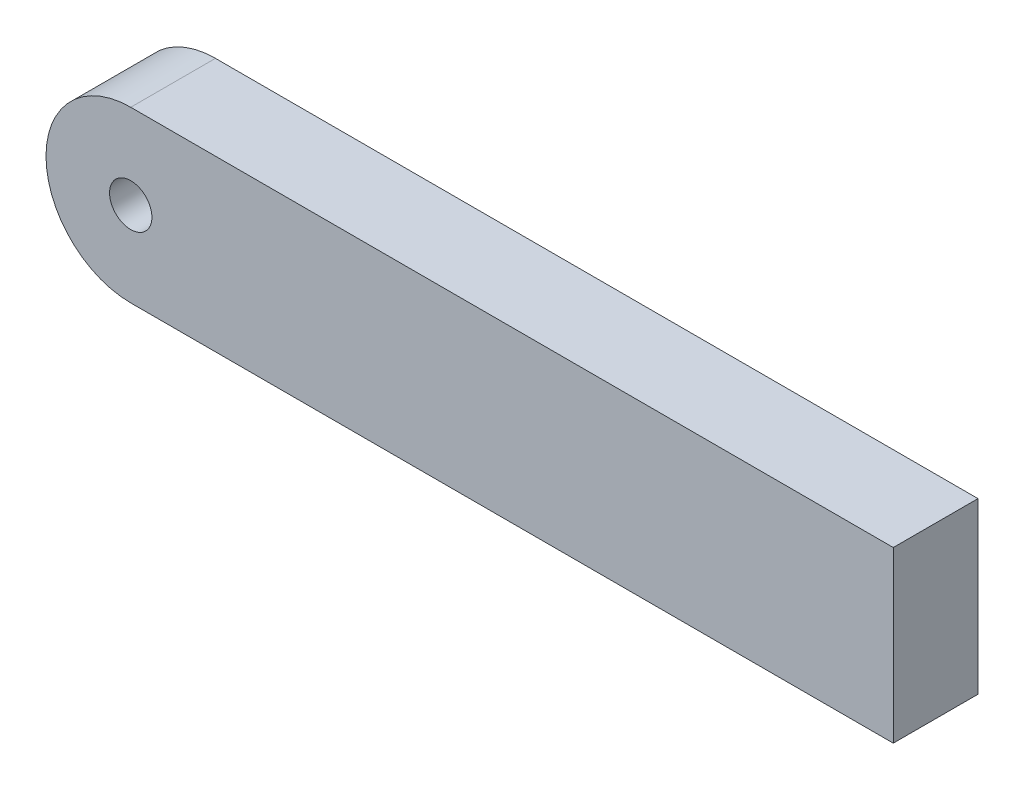
ISO-10303-21;
HEADER;
FILE_DESCRIPTION(('STEP AP214'),'2;1');
FILE_NAME('part.step','',(''),(''),'','','');
FILE_SCHEMA(('AUTOMOTIVE_DESIGN { 1 0 10303 214 1 1 1 1 }'));
ENDSEC;
DATA;
#1=APPLICATION_CONTEXT('core data for automotive mechanical design processes');
#2=APPLICATION_PROTOCOL_DEFINITION('international standard','automotive_design',2000,#1);
#3=PRODUCT_CONTEXT('',#1,'mechanical');
#4=PRODUCT('Part','Part','',(#3));
#5=PRODUCT_RELATED_PRODUCT_CATEGORY('part','',(#4));
#6=PRODUCT_DEFINITION_FORMATION('','',#4);
#7=PRODUCT_DEFINITION_CONTEXT('part definition',#1,'design');
#8=PRODUCT_DEFINITION('design','',#6,#7);
#9=PRODUCT_DEFINITION_SHAPE('','',#8);
#10=(LENGTH_UNIT() NAMED_UNIT(*) SI_UNIT(.MILLI.,.METRE.));
#11=(NAMED_UNIT(*) PLANE_ANGLE_UNIT() SI_UNIT($,.RADIAN.));
#12=(NAMED_UNIT(*) SI_UNIT($,.STERADIAN.) SOLID_ANGLE_UNIT());
#13=UNCERTAINTY_MEASURE_WITH_UNIT(LENGTH_MEASURE(1.E-05),#10,'distance_accuracy_value','');
#14=(GEOMETRIC_REPRESENTATION_CONTEXT(3) GLOBAL_UNCERTAINTY_ASSIGNED_CONTEXT((#13)) GLOBAL_UNIT_ASSIGNED_CONTEXT((#10,
#11,#12)) REPRESENTATION_CONTEXT('',''));
#15=CARTESIAN_POINT('',(0.,0.,0.));
#16=DIRECTION('',(0.,0.,1.));
#17=DIRECTION('',(1.,0.,0.));
#18=AXIS2_PLACEMENT_3D('',#15,#16,#17);
#19=CARTESIAN_POINT('',(0.,0.,10.));
#20=DIRECTION('',(0.,0.,-1.));
#21=DIRECTION('',(-1.,0.,0.));
#22=AXIS2_PLACEMENT_3D('',#19,#20,#21);
#23=CYLINDRICAL_SURFACE('',#22,10.);
#24=CARTESIAN_POINT('',(0.,0.,0.));
#25=DIRECTION('',(0.,0.,1.));
#26=DIRECTION('',(1.,0.,0.));
#27=AXIS2_PLACEMENT_3D('',#24,#25,#26);
#28=CIRCLE('',#27,10.);
#29=CARTESIAN_POINT('',(0.,-10.,0.));
#30=VERTEX_POINT('',#29);
#31=CARTESIAN_POINT('',(0.,10.,0.));
#32=VERTEX_POINT('',#31);
#33=EDGE_CURVE('E101',#30,#32,#28,.F.);
#34=ORIENTED_EDGE('',*,*,#33,.F.);
#35=DIRECTION('',(0.,0.,-1.));
#36=VECTOR('',#35,1.);
#37=CARTESIAN_POINT('',(0.,-10.,10.));
#38=LINE('',#37,#36);
#39=CARTESIAN_POINT('',(0.,-10.,10.));
#40=VERTEX_POINT('',#39);
#41=EDGE_CURVE('E11',#40,#30,#38,.T.);
#42=ORIENTED_EDGE('',*,*,#41,.F.);
#43=CARTESIAN_POINT('',(0.,0.,10.));
#44=DIRECTION('',(0.,0.,1.));
#45=DIRECTION('',(1.,0.,0.));
#46=AXIS2_PLACEMENT_3D('',#43,#44,#45);
#47=CIRCLE('',#46,10.);
#48=CARTESIAN_POINT('',(0.,10.,10.));
#49=VERTEX_POINT('',#48);
#50=EDGE_CURVE('E90',#40,#49,#47,.F.);
#51=ORIENTED_EDGE('',*,*,#50,.T.);
#52=DIRECTION('',(0.,0.,-1.));
#53=VECTOR('',#52,1.);
#54=CARTESIAN_POINT('',(0.,10.,10.));
#55=LINE('',#54,#53);
#56=EDGE_CURVE('E50',#49,#32,#55,.T.);
#57=ORIENTED_EDGE('',*,*,#56,.T.);
#58=EDGE_LOOP('',(#34,#42,#51,#57));
#59=FACE_BOUND('',#58,.T.);
#60=ADVANCED_FACE('F34',(#59),#23,.T.);
#61=CARTESIAN_POINT('',(0.,-10.,10.));
#62=DIRECTION('',(0.,-1.,0.));
#63=DIRECTION('',(1.,0.,0.));
#64=AXIS2_PLACEMENT_3D('',#61,#62,#63);
#65=PLANE('',#64);
#66=DIRECTION('',(-1.,0.,0.));
#67=VECTOR('',#66,1.);
#68=CARTESIAN_POINT('',(0.,-10.,0.));
#69=LINE('',#68,#67);
#70=CARTESIAN_POINT('',(90.,-9.99999999999998,0.));
#71=VERTEX_POINT('',#70);
#72=EDGE_CURVE('E80',#71,#30,#69,.T.);
#73=ORIENTED_EDGE('',*,*,#72,.F.);
#74=DIRECTION('',(0.,0.,-1.));
#75=VECTOR('',#74,1.);
#76=CARTESIAN_POINT('',(90.,-9.99999999999998,10.));
#77=LINE('',#76,#75);
#78=CARTESIAN_POINT('',(90.,-9.99999999999998,10.));
#79=VERTEX_POINT('',#78);
#80=EDGE_CURVE('E42',#79,#71,#77,.T.);
#81=ORIENTED_EDGE('',*,*,#80,.F.);
#82=DIRECTION('',(-1.,0.,0.));
#83=VECTOR('',#82,1.);
#84=CARTESIAN_POINT('',(0.,-10.,10.));
#85=LINE('',#84,#83);
#86=EDGE_CURVE('E78',#79,#40,#85,.T.);
#87=ORIENTED_EDGE('',*,*,#86,.T.);
#88=ORIENTED_EDGE('',*,*,#41,.T.);
#89=EDGE_LOOP('',(#73,#81,#87,#88));
#90=FACE_BOUND('',#89,.T.);
#91=ADVANCED_FACE('F77',(#90),#65,.T.);
#92=CARTESIAN_POINT('',(90.,2.4980018054066E-13,10.));
#93=DIRECTION('',(1.,0.,0.));
#94=DIRECTION('',(0.,1.,0.));
#95=AXIS2_PLACEMENT_3D('',#92,#93,#94);
#96=PLANE('',#95);
#97=DIRECTION('',(0.,-1.,0.));
#98=VECTOR('',#97,1.);
#99=CARTESIAN_POINT('',(90.,2.4980018054066E-13,0.));
#100=LINE('',#99,#98);
#101=CARTESIAN_POINT('',(90.,10.,0.));
#102=VERTEX_POINT('',#101);
#103=EDGE_CURVE('E104',#102,#71,#100,.T.);
#104=ORIENTED_EDGE('',*,*,#103,.F.);
#105=DIRECTION('',(0.,0.,-1.));
#106=VECTOR('',#105,1.);
#107=CARTESIAN_POINT('',(90.,10.,10.));
#108=LINE('',#107,#106);
#109=CARTESIAN_POINT('',(90.,10.,10.));
#110=VERTEX_POINT('',#109);
#111=EDGE_CURVE('E63',#110,#102,#108,.T.);
#112=ORIENTED_EDGE('',*,*,#111,.F.);
#113=DIRECTION('',(0.,-1.,0.));
#114=VECTOR('',#113,1.);
#115=CARTESIAN_POINT('',(90.,2.4980018054066E-13,10.));
#116=LINE('',#115,#114);
#117=EDGE_CURVE('E89',#110,#79,#116,.T.);
#118=ORIENTED_EDGE('',*,*,#117,.T.);
#119=ORIENTED_EDGE('',*,*,#80,.T.);
#120=EDGE_LOOP('',(#104,#112,#118,#119));
#121=FACE_BOUND('',#120,.T.);
#122=ADVANCED_FACE('F92',(#121),#96,.T.);
#123=CARTESIAN_POINT('',(0.,10.,10.));
#124=DIRECTION('',(0.,1.,0.));
#125=DIRECTION('',(0.,0.,1.));
#126=AXIS2_PLACEMENT_3D('',#123,#124,#125);
#127=PLANE('',#126);
#128=DIRECTION('',(1.,0.,0.));
#129=VECTOR('',#128,1.);
#130=CARTESIAN_POINT('',(0.,10.,0.));
#131=LINE('',#130,#129);
#132=EDGE_CURVE('E106',#32,#102,#131,.T.);
#133=ORIENTED_EDGE('',*,*,#132,.F.);
#134=ORIENTED_EDGE('',*,*,#56,.F.);
#135=DIRECTION('',(1.,0.,0.));
#136=VECTOR('',#135,1.);
#137=CARTESIAN_POINT('',(0.,10.,10.));
#138=LINE('',#137,#136);
#139=EDGE_CURVE('E93',#49,#110,#138,.T.);
#140=ORIENTED_EDGE('',*,*,#139,.T.);
#141=ORIENTED_EDGE('',*,*,#111,.T.);
#142=EDGE_LOOP('',(#133,#134,#140,#141));
#143=FACE_BOUND('',#142,.T.);
#144=ADVANCED_FACE('F115',(#143),#127,.T.);
#145=CARTESIAN_POINT('',(0.,0.,10.));
#146=DIRECTION('',(0.,0.,-1.));
#147=DIRECTION('',(-1.,0.,0.));
#148=AXIS2_PLACEMENT_3D('',#145,#146,#147);
#149=CYLINDRICAL_SURFACE('',#148,2.5);
#150=CARTESIAN_POINT('',(0.,0.,10.));
#151=DIRECTION('',(0.,0.,1.));
#152=DIRECTION('',(1.,0.,0.));
#153=AXIS2_PLACEMENT_3D('',#150,#151,#152);
#154=CIRCLE('',#153,2.5);
#155=CARTESIAN_POINT('',(2.5,0.,10.));
#156=VERTEX_POINT('',#155);
#157=EDGE_CURVE('E95',#156,#156,#154,.T.);
#158=ORIENTED_EDGE('',*,*,#157,.T.);
#159=EDGE_LOOP('',(#158));
#160=FACE_BOUND('',#159,.T.);
#161=CARTESIAN_POINT('',(0.,0.,0.));
#162=DIRECTION('',(0.,0.,1.));
#163=DIRECTION('',(1.,0.,0.));
#164=AXIS2_PLACEMENT_3D('',#161,#162,#163);
#165=CIRCLE('',#164,2.5);
#166=CARTESIAN_POINT('',(2.5,0.,0.));
#167=VERTEX_POINT('',#166);
#168=EDGE_CURVE('E109',#167,#167,#165,.T.);
#169=ORIENTED_EDGE('',*,*,#168,.F.);
#170=EDGE_LOOP('',(#169));
#171=FACE_BOUND('',#170,.T.);
#172=ADVANCED_FACE('F117',(#160,#171),#149,.F.);
#173=CARTESIAN_POINT('',(0.,0.,10.));
#174=DIRECTION('',(0.,0.,1.));
#175=DIRECTION('',(1.,0.,0.));
#176=AXIS2_PLACEMENT_3D('',#173,#174,#175);
#177=PLANE('',#176);
#178=ORIENTED_EDGE('',*,*,#50,.F.);
#179=ORIENTED_EDGE('',*,*,#86,.F.);
#180=ORIENTED_EDGE('',*,*,#117,.F.);
#181=ORIENTED_EDGE('',*,*,#139,.F.);
#182=EDGE_LOOP('',(#178,#179,#180,#181));
#183=FACE_BOUND('',#182,.T.);
#184=ORIENTED_EDGE('',*,*,#157,.F.);
#185=EDGE_LOOP('',(#184));
#186=FACE_BOUND('',#185,.T.);
#187=ADVANCED_FACE('F86',(#183,#186),#177,.T.);
#188=CARTESIAN_POINT('',(0.,0.,0.));
#189=DIRECTION('',(0.,0.,1.));
#190=DIRECTION('',(1.,0.,0.));
#191=AXIS2_PLACEMENT_3D('',#188,#189,#190);
#192=PLANE('',#191);
#193=ORIENTED_EDGE('',*,*,#33,.T.);
#194=ORIENTED_EDGE('',*,*,#132,.T.);
#195=ORIENTED_EDGE('',*,*,#103,.T.);
#196=ORIENTED_EDGE('',*,*,#72,.T.);
#197=EDGE_LOOP('',(#193,#194,#195,#196));
#198=FACE_BOUND('',#197,.T.);
#199=ORIENTED_EDGE('',*,*,#168,.T.);
#200=EDGE_LOOP('',(#199));
#201=FACE_BOUND('',#200,.T.);
#202=ADVANCED_FACE('F155',(#198,#201),#192,.F.);
#203=CLOSED_SHELL('',(#60,#91,#122,#144,#172,#187,#202));
#204=MANIFOLD_SOLID_BREP('B2',#203);
#205=ADVANCED_BREP_SHAPE_REPRESENTATION('',(#18,#204),#14);
#206=SHAPE_DEFINITION_REPRESENTATION(#9,#205);
ENDSEC;
END-ISO-10303-21;
